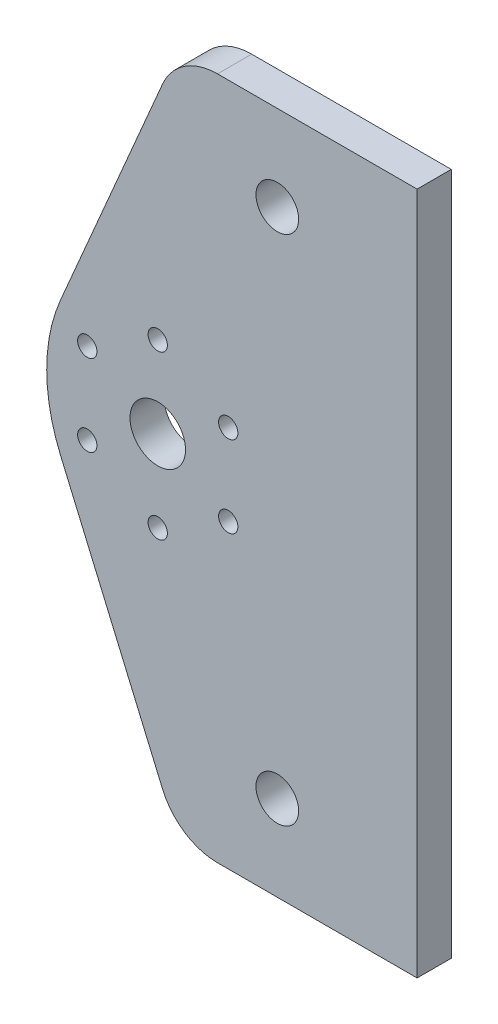
ISO-10303-21;
HEADER;
FILE_DESCRIPTION(('STEP AP214'),'2;1');
FILE_NAME('part.step','',(''),(''),'','','');
FILE_SCHEMA(('AUTOMOTIVE_DESIGN { 1 0 10303 214 1 1 1 1 }'));
ENDSEC;
DATA;
#1=APPLICATION_CONTEXT('core data for automotive mechanical design processes');
#2=APPLICATION_PROTOCOL_DEFINITION('international standard','automotive_design',2000,#1);
#3=PRODUCT_CONTEXT('',#1,'mechanical');
#4=PRODUCT('Part','Part','',(#3));
#5=PRODUCT_RELATED_PRODUCT_CATEGORY('part','',(#4));
#6=PRODUCT_DEFINITION_FORMATION('','',#4);
#7=PRODUCT_DEFINITION_CONTEXT('part definition',#1,'design');
#8=PRODUCT_DEFINITION('design','',#6,#7);
#9=PRODUCT_DEFINITION_SHAPE('','',#8);
#10=(LENGTH_UNIT() NAMED_UNIT(*) SI_UNIT(.MILLI.,.METRE.));
#11=(NAMED_UNIT(*) PLANE_ANGLE_UNIT() SI_UNIT($,.RADIAN.));
#12=(NAMED_UNIT(*) SI_UNIT($,.STERADIAN.) SOLID_ANGLE_UNIT());
#13=UNCERTAINTY_MEASURE_WITH_UNIT(LENGTH_MEASURE(1.E-05),#10,'distance_accuracy_value','');
#14=(GEOMETRIC_REPRESENTATION_CONTEXT(3) GLOBAL_UNCERTAINTY_ASSIGNED_CONTEXT((#13)) GLOBAL_UNIT_ASSIGNED_CONTEXT((#10,
#11,#12)) REPRESENTATION_CONTEXT('',''));
#15=CARTESIAN_POINT('',(0.,0.,0.));
#16=DIRECTION('',(0.,0.,1.));
#17=DIRECTION('',(1.,0.,0.));
#18=AXIS2_PLACEMENT_3D('',#15,#16,#17);
#19=CARTESIAN_POINT('',(-23.37,33.,2.));
#20=DIRECTION('',(0.,0.,-1.));
#21=DIRECTION('',(-1.,0.,0.));
#22=AXIS2_PLACEMENT_3D('',#19,#20,#21);
#23=PLANE('',#22);
#24=CARTESIAN_POINT('',(-30.37,-9.53,2.));
#25=DIRECTION('',(0.,0.,1.));
#26=DIRECTION('',(1.,0.,0.));
#27=AXIS2_PLACEMENT_3D('',#24,#25,#26);
#28=CIRCLE('',#27,1.13029999999999);
#29=CARTESIAN_POINT('',(-29.2397,-9.53,2.));
#30=VERTEX_POINT('',#29);
#31=EDGE_CURVE('E290',#30,#30,#28,.T.);
#32=ORIENTED_EDGE('',*,*,#31,.F.);
#33=EDGE_LOOP('',(#32));
#34=FACE_BOUND('',#33,.T.);
#35=CARTESIAN_POINT('',(-38.6232220980657,-4.76500000000001,2.));
#36=DIRECTION('',(0.,0.,1.));
#37=DIRECTION('',(1.,0.,0.));
#38=AXIS2_PLACEMENT_3D('',#35,#36,#37);
#39=CIRCLE('',#38,1.13029999999999);
#40=CARTESIAN_POINT('',(-37.4929220980657,-4.76500000000001,2.));
#41=VERTEX_POINT('',#40);
#42=EDGE_CURVE('E292',#41,#41,#39,.T.);
#43=ORIENTED_EDGE('',*,*,#42,.F.);
#44=EDGE_LOOP('',(#43));
#45=FACE_BOUND('',#44,.T.);
#46=CARTESIAN_POINT('',(-38.6232220980657,4.765,2.));
#47=DIRECTION('',(0.,0.,1.));
#48=DIRECTION('',(1.,0.,0.));
#49=AXIS2_PLACEMENT_3D('',#46,#47,#48);
#50=CIRCLE('',#49,1.13029999999999);
#51=CARTESIAN_POINT('',(-37.4929220980657,4.765,2.));
#52=VERTEX_POINT('',#51);
#53=EDGE_CURVE('E297',#52,#52,#50,.T.);
#54=ORIENTED_EDGE('',*,*,#53,.F.);
#55=EDGE_LOOP('',(#54));
#56=FACE_BOUND('',#55,.T.);
#57=CARTESIAN_POINT('',(-30.37,9.53,2.));
#58=DIRECTION('',(0.,0.,1.));
#59=DIRECTION('',(1.,0.,0.));
#60=AXIS2_PLACEMENT_3D('',#57,#58,#59);
#61=CIRCLE('',#60,1.13029999999999);
#62=CARTESIAN_POINT('',(-29.2397,9.53,2.));
#63=VERTEX_POINT('',#62);
#64=EDGE_CURVE('E188',#63,#63,#61,.T.);
#65=ORIENTED_EDGE('',*,*,#64,.F.);
#66=EDGE_LOOP('',(#65));
#67=FACE_BOUND('',#66,.T.);
#68=CARTESIAN_POINT('',(-22.1167779019343,4.76500000000001,2.));
#69=DIRECTION('',(0.,0.,1.));
#70=DIRECTION('',(1.,0.,0.));
#71=AXIS2_PLACEMENT_3D('',#68,#69,#70);
#72=CIRCLE('',#71,1.13029999999999);
#73=CARTESIAN_POINT('',(-20.9864779019343,4.76500000000001,2.));
#74=VERTEX_POINT('',#73);
#75=EDGE_CURVE('E177',#74,#74,#72,.T.);
#76=ORIENTED_EDGE('',*,*,#75,.F.);
#77=EDGE_LOOP('',(#76));
#78=FACE_BOUND('',#77,.T.);
#79=CARTESIAN_POINT('',(-22.1167779019343,-4.765,2.));
#80=DIRECTION('',(0.,0.,1.));
#81=DIRECTION('',(1.,0.,0.));
#82=AXIS2_PLACEMENT_3D('',#79,#80,#81);
#83=CIRCLE('',#82,1.13029999999999);
#84=CARTESIAN_POINT('',(-20.9864779019343,-4.765,2.));
#85=VERTEX_POINT('',#84);
#86=EDGE_CURVE('E174',#85,#85,#83,.T.);
#87=ORIENTED_EDGE('',*,*,#86,.F.);
#88=EDGE_LOOP('',(#87));
#89=FACE_BOUND('',#88,.T.);
#90=CARTESIAN_POINT('',(-16.37,30.,2.));
#91=DIRECTION('',(0.,0.,1.));
#92=DIRECTION('',(1.,0.,0.));
#93=AXIS2_PLACEMENT_3D('',#90,#91,#92);
#94=CIRCLE('',#93,2.5);
#95=CARTESIAN_POINT('',(-13.87,30.,2.));
#96=VERTEX_POINT('',#95);
#97=EDGE_CURVE('E198',#96,#96,#94,.T.);
#98=ORIENTED_EDGE('',*,*,#97,.F.);
#99=EDGE_LOOP('',(#98));
#100=FACE_BOUND('',#99,.T.);
#101=DIRECTION('',(1.,0.,0.));
#102=VECTOR('',#101,1.);
#103=CARTESIAN_POINT('',(-23.37,-40.,2.));
#104=LINE('',#103,#102);
#105=CARTESIAN_POINT('',(-23.37,-40.,2.));
#106=VERTEX_POINT('',#105);
#107=CARTESIAN_POINT('',(0.,-40.,2.));
#108=VERTEX_POINT('',#107);
#109=EDGE_CURVE('E159',#106,#108,#104,.T.);
#110=ORIENTED_EDGE('',*,*,#109,.T.);
#111=DIRECTION('',(0.,1.,0.));
#112=VECTOR('',#111,1.);
#113=CARTESIAN_POINT('',(0.,-40.,2.));
#114=LINE('',#113,#112);
#115=CARTESIAN_POINT('',(0.,40.,2.));
#116=VERTEX_POINT('',#115);
#117=EDGE_CURVE('E107',#108,#116,#114,.T.);
#118=ORIENTED_EDGE('',*,*,#117,.T.);
#119=DIRECTION('',(-1.,0.,0.));
#120=VECTOR('',#119,1.);
#121=CARTESIAN_POINT('',(-23.37,40.,2.));
#122=LINE('',#121,#120);
#123=CARTESIAN_POINT('',(-23.37,40.,2.));
#124=VERTEX_POINT('',#123);
#125=EDGE_CURVE('E210',#116,#124,#122,.T.);
#126=ORIENTED_EDGE('',*,*,#125,.T.);
#127=CARTESIAN_POINT('',(-23.37,33.,2.));
#128=DIRECTION('',(0.,0.,1.));
#129=DIRECTION('',(-1.,0.,0.));
#130=AXIS2_PLACEMENT_3D('',#127,#128,#129);
#131=CIRCLE('',#130,7.);
#132=CARTESIAN_POINT('',(-29.8039549222256,35.7575757575758,2.));
#133=VERTEX_POINT('',#132);
#134=EDGE_CURVE('E212',#124,#133,#131,.T.);
#135=ORIENTED_EDGE('',*,*,#134,.T.);
#136=DIRECTION('',(-0.393939393939395,-0.919136417460794,0.));
#137=VECTOR('',#136,1.);
#138=CARTESIAN_POINT('',(-29.8039549222256,35.7575757575758,2.));
#139=LINE('',#138,#137);
#140=CARTESIAN_POINT('',(-41.7527283492159,7.87878787878789,2.));
#141=VERTEX_POINT('',#140);
#142=EDGE_CURVE('E126',#133,#141,#139,.T.);
#143=ORIENTED_EDGE('',*,*,#142,.T.);
#144=CARTESIAN_POINT('',(-23.37,0.,2.));
#145=DIRECTION('',(0.,0.,1.));
#146=DIRECTION('',(-1.,0.,0.));
#147=AXIS2_PLACEMENT_3D('',#144,#145,#146);
#148=CIRCLE('',#147,20.);
#149=CARTESIAN_POINT('',(-41.7527283492159,-7.87878787878789,2.));
#150=VERTEX_POINT('',#149);
#151=EDGE_CURVE('E120',#141,#150,#148,.T.);
#152=ORIENTED_EDGE('',*,*,#151,.T.);
#153=DIRECTION('',(0.393939393939395,-0.919136417460794,0.));
#154=VECTOR('',#153,1.);
#155=CARTESIAN_POINT('',(-41.7527283492159,-7.87878787878789,2.));
#156=LINE('',#155,#154);
#157=CARTESIAN_POINT('',(-29.8039549222256,-35.7575757575758,2.));
#158=VERTEX_POINT('',#157);
#159=EDGE_CURVE('E124',#150,#158,#156,.T.);
#160=ORIENTED_EDGE('',*,*,#159,.T.);
#161=CARTESIAN_POINT('',(-23.37,-33.,2.));
#162=DIRECTION('',(0.,0.,1.));
#163=DIRECTION('',(1.,0.,0.));
#164=AXIS2_PLACEMENT_3D('',#161,#162,#163);
#165=CIRCLE('',#164,7.);
#166=EDGE_CURVE('E64',#158,#106,#165,.T.);
#167=ORIENTED_EDGE('',*,*,#166,.T.);
#168=EDGE_LOOP('',(#110,#118,#126,#135,#143,#152,#160,#167));
#169=FACE_BOUND('',#168,.T.);
#170=CARTESIAN_POINT('',(-30.37,0.,2.));
#171=DIRECTION('',(0.,0.,1.));
#172=DIRECTION('',(1.,0.,0.));
#173=AXIS2_PLACEMENT_3D('',#170,#171,#172);
#174=CIRCLE('',#173,3.25);
#175=CARTESIAN_POINT('',(-27.12,0.,2.));
#176=VERTEX_POINT('',#175);
#177=EDGE_CURVE('E148',#176,#176,#174,.T.);
#178=ORIENTED_EDGE('',*,*,#177,.F.);
#179=EDGE_LOOP('',(#178));
#180=FACE_BOUND('',#179,.T.);
#181=CARTESIAN_POINT('',(-16.37,-30.,2.));
#182=DIRECTION('',(0.,0.,1.));
#183=DIRECTION('',(1.,0.,0.));
#184=AXIS2_PLACEMENT_3D('',#181,#182,#183);
#185=CIRCLE('',#184,2.50000000000002);
#186=CARTESIAN_POINT('',(-13.87,-30.,2.));
#187=VERTEX_POINT('',#186);
#188=EDGE_CURVE('E192',#187,#187,#185,.T.);
#189=ORIENTED_EDGE('',*,*,#188,.F.);
#190=EDGE_LOOP('',(#189));
#191=FACE_BOUND('',#190,.T.);
#192=ADVANCED_FACE('F45',(#34,#45,#56,#67,#78,#89,#100,#169,#180,#191),#23,.F.);
#193=CARTESIAN_POINT('',(-23.37,33.,-2.));
#194=DIRECTION('',(0.,0.,-1.));
#195=DIRECTION('',(-1.,0.,0.));
#196=AXIS2_PLACEMENT_3D('',#193,#194,#195);
#197=PLANE('',#196);
#198=CARTESIAN_POINT('',(-30.37,-9.53,-2.));
#199=DIRECTION('',(0.,0.,-1.));
#200=DIRECTION('',(-1.,0.,0.));
#201=AXIS2_PLACEMENT_3D('',#198,#199,#200);
#202=CIRCLE('',#201,1.13029999999999);
#203=CARTESIAN_POINT('',(-31.5003,-9.53,-2.));
#204=VERTEX_POINT('',#203);
#205=EDGE_CURVE('E288',#204,#204,#202,.T.);
#206=ORIENTED_EDGE('',*,*,#205,.F.);
#207=EDGE_LOOP('',(#206));
#208=FACE_BOUND('',#207,.T.);
#209=CARTESIAN_POINT('',(-38.6232220980657,-4.76500000000001,-2.));
#210=DIRECTION('',(0.,0.,-1.));
#211=DIRECTION('',(-1.,0.,0.));
#212=AXIS2_PLACEMENT_3D('',#209,#210,#211);
#213=CIRCLE('',#212,1.13029999999999);
#214=CARTESIAN_POINT('',(-39.7535220980657,-4.76500000000001,-2.));
#215=VERTEX_POINT('',#214);
#216=EDGE_CURVE('E49',#215,#215,#213,.T.);
#217=ORIENTED_EDGE('',*,*,#216,.F.);
#218=EDGE_LOOP('',(#217));
#219=FACE_BOUND('',#218,.T.);
#220=CARTESIAN_POINT('',(-38.6232220980657,4.765,-2.));
#221=DIRECTION('',(0.,0.,-1.));
#222=DIRECTION('',(-1.,0.,0.));
#223=AXIS2_PLACEMENT_3D('',#220,#221,#222);
#224=CIRCLE('',#223,1.13029999999999);
#225=CARTESIAN_POINT('',(-39.7535220980657,4.765,-2.));
#226=VERTEX_POINT('',#225);
#227=EDGE_CURVE('E300',#226,#226,#224,.T.);
#228=ORIENTED_EDGE('',*,*,#227,.F.);
#229=EDGE_LOOP('',(#228));
#230=FACE_BOUND('',#229,.T.);
#231=CARTESIAN_POINT('',(-30.37,9.53,-2.));
#232=DIRECTION('',(0.,0.,-1.));
#233=DIRECTION('',(-1.,0.,0.));
#234=AXIS2_PLACEMENT_3D('',#231,#232,#233);
#235=CIRCLE('',#234,1.13029999999999);
#236=CARTESIAN_POINT('',(-31.5003,9.53,-2.));
#237=VERTEX_POINT('',#236);
#238=EDGE_CURVE('E183',#237,#237,#235,.T.);
#239=ORIENTED_EDGE('',*,*,#238,.F.);
#240=EDGE_LOOP('',(#239));
#241=FACE_BOUND('',#240,.T.);
#242=CARTESIAN_POINT('',(-22.1167779019343,4.76500000000001,-2.));
#243=DIRECTION('',(0.,0.,-1.));
#244=DIRECTION('',(-1.,0.,0.));
#245=AXIS2_PLACEMENT_3D('',#242,#243,#244);
#246=CIRCLE('',#245,1.13029999999999);
#247=CARTESIAN_POINT('',(-23.2470779019343,4.76500000000001,-2.));
#248=VERTEX_POINT('',#247);
#249=EDGE_CURVE('E175',#248,#248,#246,.T.);
#250=ORIENTED_EDGE('',*,*,#249,.F.);
#251=EDGE_LOOP('',(#250));
#252=FACE_BOUND('',#251,.T.);
#253=CARTESIAN_POINT('',(-22.1167779019343,-4.765,-2.));
#254=DIRECTION('',(0.,0.,-1.));
#255=DIRECTION('',(-1.,0.,0.));
#256=AXIS2_PLACEMENT_3D('',#253,#254,#255);
#257=CIRCLE('',#256,1.13029999999999);
#258=CARTESIAN_POINT('',(-23.2470779019343,-4.765,-2.));
#259=VERTEX_POINT('',#258);
#260=EDGE_CURVE('E171',#259,#259,#257,.T.);
#261=ORIENTED_EDGE('',*,*,#260,.F.);
#262=EDGE_LOOP('',(#261));
#263=FACE_BOUND('',#262,.T.);
#264=CARTESIAN_POINT('',(-16.37,30.,-2.));
#265=DIRECTION('',(0.,0.,1.));
#266=DIRECTION('',(1.,0.,0.));
#267=AXIS2_PLACEMENT_3D('',#264,#265,#266);
#268=CIRCLE('',#267,2.5);
#269=CARTESIAN_POINT('',(-13.87,30.,-2.));
#270=VERTEX_POINT('',#269);
#271=EDGE_CURVE('E195',#270,#270,#268,.T.);
#272=ORIENTED_EDGE('',*,*,#271,.T.);
#273=EDGE_LOOP('',(#272));
#274=FACE_BOUND('',#273,.T.);
#275=DIRECTION('',(1.,0.,0.));
#276=VECTOR('',#275,1.);
#277=CARTESIAN_POINT('',(-23.37,-40.,-2.));
#278=LINE('',#277,#276);
#279=CARTESIAN_POINT('',(-23.37,-40.,-2.));
#280=VERTEX_POINT('',#279);
#281=CARTESIAN_POINT('',(0.,-40.,-2.));
#282=VERTEX_POINT('',#281);
#283=EDGE_CURVE('E144',#280,#282,#278,.T.);
#284=ORIENTED_EDGE('',*,*,#283,.F.);
#285=CARTESIAN_POINT('',(-23.37,-33.,-2.));
#286=DIRECTION('',(0.,0.,1.));
#287=DIRECTION('',(1.,0.,0.));
#288=AXIS2_PLACEMENT_3D('',#285,#286,#287);
#289=CIRCLE('',#288,7.);
#290=CARTESIAN_POINT('',(-29.8039549222256,-35.7575757575758,-2.));
#291=VERTEX_POINT('',#290);
#292=EDGE_CURVE('E99',#291,#280,#289,.T.);
#293=ORIENTED_EDGE('',*,*,#292,.F.);
#294=DIRECTION('',(0.393939393939395,-0.919136417460794,0.));
#295=VECTOR('',#294,1.);
#296=CARTESIAN_POINT('',(-41.7527283492159,-7.87878787878789,-2.));
#297=LINE('',#296,#295);
#298=CARTESIAN_POINT('',(-41.7527283492159,-7.87878787878789,-2.));
#299=VERTEX_POINT('',#298);
#300=EDGE_CURVE('E93',#299,#291,#297,.T.);
#301=ORIENTED_EDGE('',*,*,#300,.F.);
#302=CARTESIAN_POINT('',(-23.37,0.,-2.));
#303=DIRECTION('',(0.,0.,1.));
#304=DIRECTION('',(-1.,0.,0.));
#305=AXIS2_PLACEMENT_3D('',#302,#303,#304);
#306=CIRCLE('',#305,20.);
#307=CARTESIAN_POINT('',(-41.7527283492159,7.87878787878789,-2.));
#308=VERTEX_POINT('',#307);
#309=EDGE_CURVE('E134',#308,#299,#306,.T.);
#310=ORIENTED_EDGE('',*,*,#309,.F.);
#311=DIRECTION('',(-0.393939393939395,-0.919136417460794,0.));
#312=VECTOR('',#311,1.);
#313=CARTESIAN_POINT('',(-29.8039549222256,35.7575757575758,-2.));
#314=LINE('',#313,#312);
#315=CARTESIAN_POINT('',(-29.8039549222256,35.7575757575758,-2.));
#316=VERTEX_POINT('',#315);
#317=EDGE_CURVE('E154',#316,#308,#314,.T.);
#318=ORIENTED_EDGE('',*,*,#317,.F.);
#319=CARTESIAN_POINT('',(-23.37,33.,-2.));
#320=DIRECTION('',(0.,0.,1.));
#321=DIRECTION('',(-1.,0.,0.));
#322=AXIS2_PLACEMENT_3D('',#319,#320,#321);
#323=CIRCLE('',#322,7.);
#324=CARTESIAN_POINT('',(-23.37,40.,-2.));
#325=VERTEX_POINT('',#324);
#326=EDGE_CURVE('E152',#325,#316,#323,.T.);
#327=ORIENTED_EDGE('',*,*,#326,.F.);
#328=DIRECTION('',(-1.,0.,0.));
#329=VECTOR('',#328,1.);
#330=CARTESIAN_POINT('',(-23.37,40.,-2.));
#331=LINE('',#330,#329);
#332=CARTESIAN_POINT('',(0.,40.,-2.));
#333=VERTEX_POINT('',#332);
#334=EDGE_CURVE('E150',#333,#325,#331,.T.);
#335=ORIENTED_EDGE('',*,*,#334,.F.);
#336=DIRECTION('',(0.,1.,0.));
#337=VECTOR('',#336,1.);
#338=CARTESIAN_POINT('',(0.,-40.,-2.));
#339=LINE('',#338,#337);
#340=EDGE_CURVE('E147',#282,#333,#339,.T.);
#341=ORIENTED_EDGE('',*,*,#340,.F.);
#342=EDGE_LOOP('',(#284,#293,#301,#310,#318,#327,#335,#341));
#343=FACE_BOUND('',#342,.T.);
#344=CARTESIAN_POINT('',(-30.37,0.,-2.));
#345=DIRECTION('',(0.,0.,1.));
#346=DIRECTION('',(1.,0.,0.));
#347=AXIS2_PLACEMENT_3D('',#344,#345,#346);
#348=CIRCLE('',#347,3.25);
#349=CARTESIAN_POINT('',(-27.12,0.,-2.));
#350=VERTEX_POINT('',#349);
#351=EDGE_CURVE('E201',#350,#350,#348,.T.);
#352=ORIENTED_EDGE('',*,*,#351,.T.);
#353=EDGE_LOOP('',(#352));
#354=FACE_BOUND('',#353,.T.);
#355=CARTESIAN_POINT('',(-16.37,-30.,-2.));
#356=DIRECTION('',(0.,0.,1.));
#357=DIRECTION('',(1.,0.,0.));
#358=AXIS2_PLACEMENT_3D('',#355,#356,#357);
#359=CIRCLE('',#358,2.50000000000002);
#360=CARTESIAN_POINT('',(-13.87,-30.,-2.));
#361=VERTEX_POINT('',#360);
#362=EDGE_CURVE('E173',#361,#361,#359,.T.);
#363=ORIENTED_EDGE('',*,*,#362,.T.);
#364=EDGE_LOOP('',(#363));
#365=FACE_BOUND('',#364,.T.);
#366=ADVANCED_FACE('F225',(#208,#219,#230,#241,#252,#263,#274,#343,#354,#365),#197,.T.);
#367=CARTESIAN_POINT('',(-23.37,-40.,2.));
#368=DIRECTION('',(0.,1.,0.));
#369=DIRECTION('',(0.,0.,1.));
#370=AXIS2_PLACEMENT_3D('',#367,#368,#369);
#371=PLANE('',#370);
#372=ORIENTED_EDGE('',*,*,#283,.T.);
#373=DIRECTION('',(0.,0.,-1.));
#374=VECTOR('',#373,1.);
#375=CARTESIAN_POINT('',(0.,-40.,2.));
#376=LINE('',#375,#374);
#377=EDGE_CURVE('E11',#108,#282,#376,.T.);
#378=ORIENTED_EDGE('',*,*,#377,.F.);
#379=ORIENTED_EDGE('',*,*,#109,.F.);
#380=DIRECTION('',(0.,0.,-1.));
#381=VECTOR('',#380,1.);
#382=CARTESIAN_POINT('',(-23.37,-40.,2.));
#383=LINE('',#382,#381);
#384=EDGE_CURVE('E140',#106,#280,#383,.T.);
#385=ORIENTED_EDGE('',*,*,#384,.T.);
#386=EDGE_LOOP('',(#372,#378,#379,#385));
#387=FACE_BOUND('',#386,.T.);
#388=ADVANCED_FACE('F47',(#387),#371,.F.);
#389=CARTESIAN_POINT('',(0.,-40.,2.));
#390=DIRECTION('',(-1.,0.,0.));
#391=DIRECTION('',(0.,0.,1.));
#392=AXIS2_PLACEMENT_3D('',#389,#390,#391);
#393=PLANE('',#392);
#394=ORIENTED_EDGE('',*,*,#340,.T.);
#395=DIRECTION('',(0.,0.,-1.));
#396=VECTOR('',#395,1.);
#397=CARTESIAN_POINT('',(0.,40.,2.));
#398=LINE('',#397,#396);
#399=EDGE_CURVE('E55',#116,#333,#398,.T.);
#400=ORIENTED_EDGE('',*,*,#399,.F.);
#401=ORIENTED_EDGE('',*,*,#117,.F.);
#402=ORIENTED_EDGE('',*,*,#377,.T.);
#403=EDGE_LOOP('',(#394,#400,#401,#402));
#404=FACE_BOUND('',#403,.T.);
#405=ADVANCED_FACE('F430',(#404),#393,.F.);
#406=CARTESIAN_POINT('',(-23.37,40.,2.));
#407=DIRECTION('',(0.,-1.,0.));
#408=DIRECTION('',(0.,0.,-1.));
#409=AXIS2_PLACEMENT_3D('',#406,#407,#408);
#410=PLANE('',#409);
#411=ORIENTED_EDGE('',*,*,#334,.T.);
#412=DIRECTION('',(0.,0.,-1.));
#413=VECTOR('',#412,1.);
#414=CARTESIAN_POINT('',(-23.37,40.,2.));
#415=LINE('',#414,#413);
#416=EDGE_CURVE('E166',#124,#325,#415,.T.);
#417=ORIENTED_EDGE('',*,*,#416,.F.);
#418=ORIENTED_EDGE('',*,*,#125,.F.);
#419=ORIENTED_EDGE('',*,*,#399,.T.);
#420=EDGE_LOOP('',(#411,#417,#418,#419));
#421=FACE_BOUND('',#420,.T.);
#422=ADVANCED_FACE('F423',(#421),#410,.F.);
#423=CARTESIAN_POINT('',(-23.37,33.,2.));
#424=DIRECTION('',(0.,0.,-1.));
#425=DIRECTION('',(-1.,0.,0.));
#426=AXIS2_PLACEMENT_3D('',#423,#424,#425);
#427=CYLINDRICAL_SURFACE('',#426,7.);
#428=ORIENTED_EDGE('',*,*,#326,.T.);
#429=DIRECTION('',(0.,0.,-1.));
#430=VECTOR('',#429,1.);
#431=CARTESIAN_POINT('',(-29.8039549222256,35.7575757575758,2.));
#432=LINE('',#431,#430);
#433=EDGE_CURVE('E163',#133,#316,#432,.T.);
#434=ORIENTED_EDGE('',*,*,#433,.F.);
#435=ORIENTED_EDGE('',*,*,#134,.F.);
#436=ORIENTED_EDGE('',*,*,#416,.T.);
#437=EDGE_LOOP('',(#428,#434,#435,#436));
#438=FACE_BOUND('',#437,.T.);
#439=ADVANCED_FACE('F218',(#438),#427,.T.);
#440=CARTESIAN_POINT('',(-29.8039549222256,35.7575757575758,2.));
#441=DIRECTION('',(0.919136417460794,-0.393939393939395,0.));
#442=DIRECTION('',(0.393939393939395,0.919136417460794,0.));
#443=AXIS2_PLACEMENT_3D('',#440,#441,#442);
#444=PLANE('',#443);
#445=ORIENTED_EDGE('',*,*,#317,.T.);
#446=DIRECTION('',(0.,0.,-1.));
#447=VECTOR('',#446,1.);
#448=CARTESIAN_POINT('',(-41.7527283492159,7.87878787878789,2.));
#449=LINE('',#448,#447);
#450=EDGE_CURVE('E135',#141,#308,#449,.T.);
#451=ORIENTED_EDGE('',*,*,#450,.F.);
#452=ORIENTED_EDGE('',*,*,#142,.F.);
#453=ORIENTED_EDGE('',*,*,#433,.T.);
#454=EDGE_LOOP('',(#445,#451,#452,#453));
#455=FACE_BOUND('',#454,.T.);
#456=ADVANCED_FACE('F222',(#455),#444,.F.);
#457=CARTESIAN_POINT('',(-23.37,0.,2.));
#458=DIRECTION('',(0.,0.,-1.));
#459=DIRECTION('',(-1.,0.,0.));
#460=AXIS2_PLACEMENT_3D('',#457,#458,#459);
#461=CYLINDRICAL_SURFACE('',#460,20.);
#462=ORIENTED_EDGE('',*,*,#309,.T.);
#463=DIRECTION('',(0.,0.,-1.));
#464=VECTOR('',#463,1.);
#465=CARTESIAN_POINT('',(-41.7527283492159,-7.87878787878789,2.));
#466=LINE('',#465,#464);
#467=EDGE_CURVE('E131',#150,#299,#466,.T.);
#468=ORIENTED_EDGE('',*,*,#467,.F.);
#469=ORIENTED_EDGE('',*,*,#151,.F.);
#470=ORIENTED_EDGE('',*,*,#450,.T.);
#471=EDGE_LOOP('',(#462,#468,#469,#470));
#472=FACE_BOUND('',#471,.T.);
#473=ADVANCED_FACE('F132',(#472),#461,.T.);
#474=CARTESIAN_POINT('',(-41.7527283492159,-7.87878787878789,2.));
#475=DIRECTION('',(0.919136417460794,0.393939393939395,0.));
#476=DIRECTION('',(-0.393939393939395,0.919136417460794,0.));
#477=AXIS2_PLACEMENT_3D('',#474,#475,#476);
#478=PLANE('',#477);
#479=ORIENTED_EDGE('',*,*,#300,.T.);
#480=DIRECTION('',(0.,0.,-1.));
#481=VECTOR('',#480,1.);
#482=CARTESIAN_POINT('',(-29.8039549222256,-35.7575757575758,2.));
#483=LINE('',#482,#481);
#484=EDGE_CURVE('E136',#158,#291,#483,.T.);
#485=ORIENTED_EDGE('',*,*,#484,.F.);
#486=ORIENTED_EDGE('',*,*,#159,.F.);
#487=ORIENTED_EDGE('',*,*,#467,.T.);
#488=EDGE_LOOP('',(#479,#485,#486,#487));
#489=FACE_BOUND('',#488,.T.);
#490=ADVANCED_FACE('F138',(#489),#478,.F.);
#491=CARTESIAN_POINT('',(-23.37,-33.,2.));
#492=DIRECTION('',(0.,0.,-1.));
#493=DIRECTION('',(-1.,0.,0.));
#494=AXIS2_PLACEMENT_3D('',#491,#492,#493);
#495=CYLINDRICAL_SURFACE('',#494,7.);
#496=ORIENTED_EDGE('',*,*,#292,.T.);
#497=ORIENTED_EDGE('',*,*,#384,.F.);
#498=ORIENTED_EDGE('',*,*,#166,.F.);
#499=ORIENTED_EDGE('',*,*,#484,.T.);
#500=EDGE_LOOP('',(#496,#497,#498,#499));
#501=FACE_BOUND('',#500,.T.);
#502=ADVANCED_FACE('F231',(#501),#495,.T.);
#503=CARTESIAN_POINT('',(-30.37,0.,2.));
#504=DIRECTION('',(0.,0.,-1.));
#505=DIRECTION('',(-1.,0.,0.));
#506=AXIS2_PLACEMENT_3D('',#503,#504,#505);
#507=CYLINDRICAL_SURFACE('',#506,3.25);
#508=ORIENTED_EDGE('',*,*,#177,.T.);
#509=EDGE_LOOP('',(#508));
#510=FACE_BOUND('',#509,.T.);
#511=ORIENTED_EDGE('',*,*,#351,.F.);
#512=EDGE_LOOP('',(#511));
#513=FACE_BOUND('',#512,.T.);
#514=ADVANCED_FACE('F233',(#510,#513),#507,.F.);
#515=CARTESIAN_POINT('',(-16.37,30.,2.));
#516=DIRECTION('',(0.,0.,-1.));
#517=DIRECTION('',(-1.,0.,0.));
#518=AXIS2_PLACEMENT_3D('',#515,#516,#517);
#519=CYLINDRICAL_SURFACE('',#518,2.5);
#520=ORIENTED_EDGE('',*,*,#97,.T.);
#521=EDGE_LOOP('',(#520));
#522=FACE_BOUND('',#521,.T.);
#523=ORIENTED_EDGE('',*,*,#271,.F.);
#524=EDGE_LOOP('',(#523));
#525=FACE_BOUND('',#524,.T.);
#526=ADVANCED_FACE('F239',(#522,#525),#519,.F.);
#527=CARTESIAN_POINT('',(-16.37,-30.,2.));
#528=DIRECTION('',(0.,0.,-1.));
#529=DIRECTION('',(-1.,0.,0.));
#530=AXIS2_PLACEMENT_3D('',#527,#528,#529);
#531=CYLINDRICAL_SURFACE('',#530,2.50000000000002);
#532=ORIENTED_EDGE('',*,*,#188,.T.);
#533=EDGE_LOOP('',(#532));
#534=FACE_BOUND('',#533,.T.);
#535=ORIENTED_EDGE('',*,*,#362,.F.);
#536=EDGE_LOOP('',(#535));
#537=FACE_BOUND('',#536,.T.);
#538=ADVANCED_FACE('F257',(#534,#537),#531,.F.);
#539=CARTESIAN_POINT('',(-22.1167779019343,-4.765,2.));
#540=DIRECTION('',(0.,0.,1.));
#541=DIRECTION('',(1.,0.,0.));
#542=AXIS2_PLACEMENT_3D('',#539,#540,#541);
#543=CYLINDRICAL_SURFACE('',#542,1.13029999999999);
#544=ORIENTED_EDGE('',*,*,#260,.T.);
#545=EDGE_LOOP('',(#544));
#546=FACE_BOUND('',#545,.T.);
#547=ORIENTED_EDGE('',*,*,#86,.T.);
#548=EDGE_LOOP('',(#547));
#549=FACE_BOUND('',#548,.T.);
#550=ADVANCED_FACE('F260',(#546,#549),#543,.F.);
#551=CARTESIAN_POINT('',(-22.1167779019343,4.76500000000001,2.));
#552=DIRECTION('',(0.,0.,1.));
#553=DIRECTION('',(1.,0.,0.));
#554=AXIS2_PLACEMENT_3D('',#551,#552,#553);
#555=CYLINDRICAL_SURFACE('',#554,1.13029999999999);
#556=ORIENTED_EDGE('',*,*,#249,.T.);
#557=EDGE_LOOP('',(#556));
#558=FACE_BOUND('',#557,.T.);
#559=ORIENTED_EDGE('',*,*,#75,.T.);
#560=EDGE_LOOP('',(#559));
#561=FACE_BOUND('',#560,.T.);
#562=ADVANCED_FACE('F264',(#558,#561),#555,.F.);
#563=CARTESIAN_POINT('',(-30.37,9.53,2.));
#564=DIRECTION('',(0.,0.,1.));
#565=DIRECTION('',(1.,0.,0.));
#566=AXIS2_PLACEMENT_3D('',#563,#564,#565);
#567=CYLINDRICAL_SURFACE('',#566,1.13029999999999);
#568=ORIENTED_EDGE('',*,*,#238,.T.);
#569=EDGE_LOOP('',(#568));
#570=FACE_BOUND('',#569,.T.);
#571=ORIENTED_EDGE('',*,*,#64,.T.);
#572=EDGE_LOOP('',(#571));
#573=FACE_BOUND('',#572,.T.);
#574=ADVANCED_FACE('F268',(#570,#573),#567,.F.);
#575=CARTESIAN_POINT('',(-38.6232220980657,4.765,2.));
#576=DIRECTION('',(0.,0.,1.));
#577=DIRECTION('',(1.,0.,0.));
#578=AXIS2_PLACEMENT_3D('',#575,#576,#577);
#579=CYLINDRICAL_SURFACE('',#578,1.13029999999999);
#580=ORIENTED_EDGE('',*,*,#227,.T.);
#581=EDGE_LOOP('',(#580));
#582=FACE_BOUND('',#581,.T.);
#583=ORIENTED_EDGE('',*,*,#53,.T.);
#584=EDGE_LOOP('',(#583));
#585=FACE_BOUND('',#584,.T.);
#586=ADVANCED_FACE('F271',(#582,#585),#579,.F.);
#587=CARTESIAN_POINT('',(-38.6232220980657,-4.76500000000001,2.));
#588=DIRECTION('',(0.,0.,1.));
#589=DIRECTION('',(1.,0.,0.));
#590=AXIS2_PLACEMENT_3D('',#587,#588,#589);
#591=CYLINDRICAL_SURFACE('',#590,1.13029999999999);
#592=ORIENTED_EDGE('',*,*,#216,.T.);
#593=EDGE_LOOP('',(#592));
#594=FACE_BOUND('',#593,.T.);
#595=ORIENTED_EDGE('',*,*,#42,.T.);
#596=EDGE_LOOP('',(#595));
#597=FACE_BOUND('',#596,.T.);
#598=ADVANCED_FACE('F275',(#594,#597),#591,.F.);
#599=CARTESIAN_POINT('',(-30.37,-9.53,2.));
#600=DIRECTION('',(0.,0.,1.));
#601=DIRECTION('',(1.,0.,0.));
#602=AXIS2_PLACEMENT_3D('',#599,#600,#601);
#603=CYLINDRICAL_SURFACE('',#602,1.13029999999999);
#604=ORIENTED_EDGE('',*,*,#205,.T.);
#605=EDGE_LOOP('',(#604));
#606=FACE_BOUND('',#605,.T.);
#607=ORIENTED_EDGE('',*,*,#31,.T.);
#608=EDGE_LOOP('',(#607));
#609=FACE_BOUND('',#608,.T.);
#610=ADVANCED_FACE('F279',(#606,#609),#603,.F.);
#611=CLOSED_SHELL('',(#192,#366,#388,#405,#422,#439,#456,#473,#490,#502,#514,#526,#538,#550,
#562,#574,#586,#598,#610));
#612=MANIFOLD_SOLID_BREP('B2',#611);
#613=ADVANCED_BREP_SHAPE_REPRESENTATION('',(#18,#612),#14);
#614=SHAPE_DEFINITION_REPRESENTATION(#9,#613);
ENDSEC;
END-ISO-10303-21;
